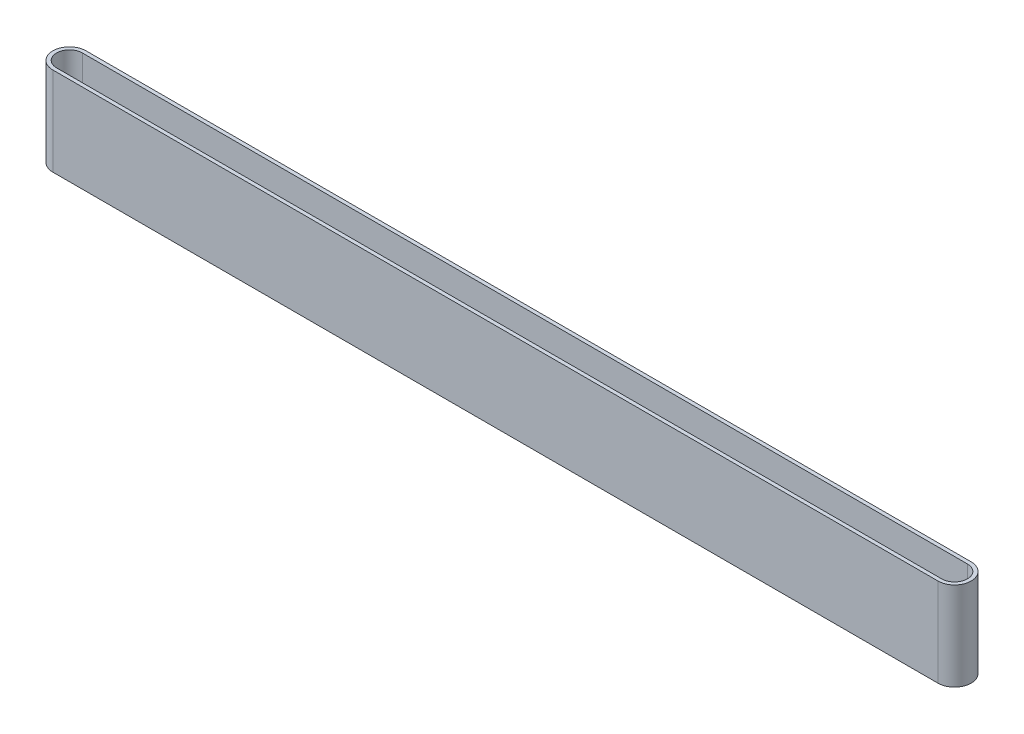
ISO-10303-21;
HEADER;
FILE_DESCRIPTION(('STEP AP214'),'2;1');
FILE_NAME('part.step','',(''),(''),'','','');
FILE_SCHEMA(('AUTOMOTIVE_DESIGN { 1 0 10303 214 1 1 1 1 }'));
ENDSEC;
DATA;
#1=APPLICATION_CONTEXT('core data for automotive mechanical design processes');
#2=APPLICATION_PROTOCOL_DEFINITION('international standard','automotive_design',2000,#1);
#3=PRODUCT_CONTEXT('',#1,'mechanical');
#4=PRODUCT('Part','Part','',(#3));
#5=PRODUCT_RELATED_PRODUCT_CATEGORY('part','',(#4));
#6=PRODUCT_DEFINITION_FORMATION('','',#4);
#7=PRODUCT_DEFINITION_CONTEXT('part definition',#1,'design');
#8=PRODUCT_DEFINITION('design','',#6,#7);
#9=PRODUCT_DEFINITION_SHAPE('','',#8);
#10=(LENGTH_UNIT() NAMED_UNIT(*) SI_UNIT(.MILLI.,.METRE.));
#11=(NAMED_UNIT(*) PLANE_ANGLE_UNIT() SI_UNIT($,.RADIAN.));
#12=(NAMED_UNIT(*) SI_UNIT($,.STERADIAN.) SOLID_ANGLE_UNIT());
#13=UNCERTAINTY_MEASURE_WITH_UNIT(LENGTH_MEASURE(1.E-05),#10,'distance_accuracy_value','');
#14=(GEOMETRIC_REPRESENTATION_CONTEXT(3) GLOBAL_UNCERTAINTY_ASSIGNED_CONTEXT((#13)) GLOBAL_UNIT_ASSIGNED_CONTEXT((#10,
#11,#12)) REPRESENTATION_CONTEXT('',''));
#15=CARTESIAN_POINT('',(0.,0.,0.));
#16=DIRECTION('',(0.,0.,1.));
#17=DIRECTION('',(1.,0.,0.));
#18=AXIS2_PLACEMENT_3D('',#15,#16,#17);
#19=CARTESIAN_POINT('',(0.,76.2,0.));
#20=DIRECTION('',(0.,1.,0.));
#21=DIRECTION('',(0.,0.,1.));
#22=AXIS2_PLACEMENT_3D('',#19,#20,#21);
#23=PLANE('',#22);
#24=CARTESIAN_POINT('',(0.,76.2,0.));
#25=DIRECTION('',(0.,1.,0.));
#26=DIRECTION('',(0.,0.,1.));
#27=AXIS2_PLACEMENT_3D('',#24,#25,#26);
#28=CIRCLE('',#27,14.2875);
#29=CARTESIAN_POINT('',(0.,76.2,-14.2875));
#30=VERTEX_POINT('',#29);
#31=CARTESIAN_POINT('',(0.,76.2,14.2875));
#32=VERTEX_POINT('',#31);
#33=EDGE_CURVE('E134',#30,#32,#28,.T.);
#34=ORIENTED_EDGE('',*,*,#33,.T.);
#35=DIRECTION('',(1.,0.,0.));
#36=VECTOR('',#35,1.);
#37=CARTESIAN_POINT('',(0.,76.2,14.2875));
#38=LINE('',#37,#36);
#39=CARTESIAN_POINT('',(762.,76.2,14.2875));
#40=VERTEX_POINT('',#39);
#41=EDGE_CURVE('E137',#32,#40,#38,.T.);
#42=ORIENTED_EDGE('',*,*,#41,.T.);
#43=CARTESIAN_POINT('',(762.,76.2,0.));
#44=DIRECTION('',(0.,1.,0.));
#45=DIRECTION('',(0.,0.,1.));
#46=AXIS2_PLACEMENT_3D('',#43,#44,#45);
#47=CIRCLE('',#46,14.2875);
#48=CARTESIAN_POINT('',(762.,76.2,-14.2875));
#49=VERTEX_POINT('',#48);
#50=EDGE_CURVE('E140',#40,#49,#47,.T.);
#51=ORIENTED_EDGE('',*,*,#50,.T.);
#52=DIRECTION('',(-1.,0.,0.));
#53=VECTOR('',#52,1.);
#54=CARTESIAN_POINT('',(0.,76.2,-14.2875));
#55=LINE('',#54,#53);
#56=EDGE_CURVE('E142',#49,#30,#55,.T.);
#57=ORIENTED_EDGE('',*,*,#56,.T.);
#58=EDGE_LOOP('',(#34,#42,#51,#57));
#59=FACE_BOUND('',#58,.T.);
#60=DIRECTION('',(1.,0.,0.));
#61=VECTOR('',#60,1.);
#62=CARTESIAN_POINT('',(0.,76.2,11.1125));
#63=LINE('',#62,#61);
#64=CARTESIAN_POINT('',(0.,76.2,11.1125));
#65=VERTEX_POINT('',#64);
#66=CARTESIAN_POINT('',(762.,76.2,11.1125));
#67=VERTEX_POINT('',#66);
#68=EDGE_CURVE('E106',#65,#67,#63,.T.);
#69=ORIENTED_EDGE('',*,*,#68,.F.);
#70=CARTESIAN_POINT('',(0.,76.2,0.));
#71=DIRECTION('',(0.,1.,0.));
#72=DIRECTION('',(0.,0.,1.));
#73=AXIS2_PLACEMENT_3D('',#70,#71,#72);
#74=CIRCLE('',#73,11.1125);
#75=CARTESIAN_POINT('',(0.,76.2,-11.1125));
#76=VERTEX_POINT('',#75);
#77=EDGE_CURVE('E98',#76,#65,#74,.T.);
#78=ORIENTED_EDGE('',*,*,#77,.F.);
#79=DIRECTION('',(-1.,0.,0.));
#80=VECTOR('',#79,1.);
#81=CARTESIAN_POINT('',(0.,76.2,-11.1125));
#82=LINE('',#81,#80);
#83=CARTESIAN_POINT('',(762.,76.2,-11.1125));
#84=VERTEX_POINT('',#83);
#85=EDGE_CURVE('E120',#84,#76,#82,.T.);
#86=ORIENTED_EDGE('',*,*,#85,.F.);
#87=CARTESIAN_POINT('',(762.,76.2,0.));
#88=DIRECTION('',(0.,1.,0.));
#89=DIRECTION('',(0.,0.,1.));
#90=AXIS2_PLACEMENT_3D('',#87,#88,#89);
#91=CIRCLE('',#90,11.1125);
#92=EDGE_CURVE('E118',#67,#84,#91,.T.);
#93=ORIENTED_EDGE('',*,*,#92,.F.);
#94=EDGE_LOOP('',(#69,#78,#86,#93));
#95=FACE_BOUND('',#94,.T.);
#96=ADVANCED_FACE('F33',(#59,#95),#23,.T.);
#97=CARTESIAN_POINT('',(0.,0.,0.));
#98=DIRECTION('',(0.,1.,0.));
#99=DIRECTION('',(0.,0.,1.));
#100=AXIS2_PLACEMENT_3D('',#97,#98,#99);
#101=PLANE('',#100);
#102=CARTESIAN_POINT('',(0.,0.,0.));
#103=DIRECTION('',(0.,1.,0.));
#104=DIRECTION('',(0.,0.,1.));
#105=AXIS2_PLACEMENT_3D('',#102,#103,#104);
#106=CIRCLE('',#105,14.2875);
#107=CARTESIAN_POINT('',(0.,0.,-14.2875));
#108=VERTEX_POINT('',#107);
#109=CARTESIAN_POINT('',(0.,0.,14.2875));
#110=VERTEX_POINT('',#109);
#111=EDGE_CURVE('E114',#108,#110,#106,.T.);
#112=ORIENTED_EDGE('',*,*,#111,.F.);
#113=DIRECTION('',(-1.,0.,0.));
#114=VECTOR('',#113,1.);
#115=CARTESIAN_POINT('',(0.,0.,-14.2875));
#116=LINE('',#115,#114);
#117=CARTESIAN_POINT('',(762.,0.,-14.2875));
#118=VERTEX_POINT('',#117);
#119=EDGE_CURVE('E138',#118,#108,#116,.T.);
#120=ORIENTED_EDGE('',*,*,#119,.F.);
#121=CARTESIAN_POINT('',(762.,0.,0.));
#122=DIRECTION('',(0.,1.,0.));
#123=DIRECTION('',(0.,0.,1.));
#124=AXIS2_PLACEMENT_3D('',#121,#122,#123);
#125=CIRCLE('',#124,14.2875);
#126=CARTESIAN_POINT('',(762.,0.,14.2875));
#127=VERTEX_POINT('',#126);
#128=EDGE_CURVE('E149',#127,#118,#125,.T.);
#129=ORIENTED_EDGE('',*,*,#128,.F.);
#130=DIRECTION('',(1.,0.,0.));
#131=VECTOR('',#130,1.);
#132=CARTESIAN_POINT('',(0.,0.,14.2875));
#133=LINE('',#132,#131);
#134=EDGE_CURVE('E147',#110,#127,#133,.T.);
#135=ORIENTED_EDGE('',*,*,#134,.F.);
#136=EDGE_LOOP('',(#112,#120,#129,#135));
#137=FACE_BOUND('',#136,.T.);
#138=CARTESIAN_POINT('',(0.,0.,0.));
#139=DIRECTION('',(0.,1.,0.));
#140=DIRECTION('',(0.,0.,1.));
#141=AXIS2_PLACEMENT_3D('',#138,#139,#140);
#142=CIRCLE('',#141,11.1125);
#143=CARTESIAN_POINT('',(0.,0.,-11.1125));
#144=VERTEX_POINT('',#143);
#145=CARTESIAN_POINT('',(0.,0.,11.1125));
#146=VERTEX_POINT('',#145);
#147=EDGE_CURVE('E56',#144,#146,#142,.T.);
#148=ORIENTED_EDGE('',*,*,#147,.T.);
#149=DIRECTION('',(1.,0.,0.));
#150=VECTOR('',#149,1.);
#151=CARTESIAN_POINT('',(0.,0.,11.1125));
#152=LINE('',#151,#150);
#153=CARTESIAN_POINT('',(762.,0.,11.1125));
#154=VERTEX_POINT('',#153);
#155=EDGE_CURVE('E113',#146,#154,#152,.T.);
#156=ORIENTED_EDGE('',*,*,#155,.T.);
#157=CARTESIAN_POINT('',(762.,0.,0.));
#158=DIRECTION('',(0.,1.,0.));
#159=DIRECTION('',(0.,0.,1.));
#160=AXIS2_PLACEMENT_3D('',#157,#158,#159);
#161=CIRCLE('',#160,11.1125);
#162=CARTESIAN_POINT('',(762.,0.,-11.1125));
#163=VERTEX_POINT('',#162);
#164=EDGE_CURVE('E126',#154,#163,#161,.T.);
#165=ORIENTED_EDGE('',*,*,#164,.T.);
#166=DIRECTION('',(-1.,0.,0.));
#167=VECTOR('',#166,1.);
#168=CARTESIAN_POINT('',(0.,0.,-11.1125));
#169=LINE('',#168,#167);
#170=EDGE_CURVE('E107',#163,#144,#169,.T.);
#171=ORIENTED_EDGE('',*,*,#170,.T.);
#172=EDGE_LOOP('',(#148,#156,#165,#171));
#173=FACE_BOUND('',#172,.T.);
#174=ADVANCED_FACE('F167',(#137,#173),#101,.F.);
#175=CARTESIAN_POINT('',(0.,76.2,0.));
#176=DIRECTION('',(0.,-1.,0.));
#177=DIRECTION('',(0.,0.,-1.));
#178=AXIS2_PLACEMENT_3D('',#175,#176,#177);
#179=CYLINDRICAL_SURFACE('',#178,14.2875);
#180=ORIENTED_EDGE('',*,*,#111,.T.);
#181=DIRECTION('',(0.,-1.,0.));
#182=VECTOR('',#181,1.);
#183=CARTESIAN_POINT('',(0.,76.2,14.2875));
#184=LINE('',#183,#182);
#185=EDGE_CURVE('E11',#32,#110,#184,.T.);
#186=ORIENTED_EDGE('',*,*,#185,.F.);
#187=ORIENTED_EDGE('',*,*,#33,.F.);
#188=DIRECTION('',(0.,-1.,0.));
#189=VECTOR('',#188,1.);
#190=CARTESIAN_POINT('',(0.,76.2,-14.2875));
#191=LINE('',#190,#189);
#192=EDGE_CURVE('E144',#30,#108,#191,.T.);
#193=ORIENTED_EDGE('',*,*,#192,.T.);
#194=EDGE_LOOP('',(#180,#186,#187,#193));
#195=FACE_BOUND('',#194,.T.);
#196=ADVANCED_FACE('F35',(#195),#179,.T.);
#197=CARTESIAN_POINT('',(0.,76.2,14.2875));
#198=DIRECTION('',(0.,0.,-1.));
#199=DIRECTION('',(-1.,0.,0.));
#200=AXIS2_PLACEMENT_3D('',#197,#198,#199);
#201=PLANE('',#200);
#202=ORIENTED_EDGE('',*,*,#134,.T.);
#203=DIRECTION('',(0.,-1.,0.));
#204=VECTOR('',#203,1.);
#205=CARTESIAN_POINT('',(762.,76.2,14.2875));
#206=LINE('',#205,#204);
#207=EDGE_CURVE('E41',#40,#127,#206,.T.);
#208=ORIENTED_EDGE('',*,*,#207,.F.);
#209=ORIENTED_EDGE('',*,*,#41,.F.);
#210=ORIENTED_EDGE('',*,*,#185,.T.);
#211=EDGE_LOOP('',(#202,#208,#209,#210));
#212=FACE_BOUND('',#211,.T.);
#213=ADVANCED_FACE('F177',(#212),#201,.F.);
#214=CARTESIAN_POINT('',(762.,76.2,0.));
#215=DIRECTION('',(0.,-1.,0.));
#216=DIRECTION('',(0.,0.,-1.));
#217=AXIS2_PLACEMENT_3D('',#214,#215,#216);
#218=CYLINDRICAL_SURFACE('',#217,14.2875);
#219=ORIENTED_EDGE('',*,*,#128,.T.);
#220=DIRECTION('',(0.,-1.,0.));
#221=VECTOR('',#220,1.);
#222=CARTESIAN_POINT('',(762.,76.2,-14.2875));
#223=LINE('',#222,#221);
#224=EDGE_CURVE('E154',#49,#118,#223,.T.);
#225=ORIENTED_EDGE('',*,*,#224,.F.);
#226=ORIENTED_EDGE('',*,*,#50,.F.);
#227=ORIENTED_EDGE('',*,*,#207,.T.);
#228=EDGE_LOOP('',(#219,#225,#226,#227));
#229=FACE_BOUND('',#228,.T.);
#230=ADVANCED_FACE('F161',(#229),#218,.T.);
#231=CARTESIAN_POINT('',(0.,76.2,-14.2875));
#232=DIRECTION('',(0.,0.,1.));
#233=DIRECTION('',(1.,0.,0.));
#234=AXIS2_PLACEMENT_3D('',#231,#232,#233);
#235=PLANE('',#234);
#236=ORIENTED_EDGE('',*,*,#119,.T.);
#237=ORIENTED_EDGE('',*,*,#192,.F.);
#238=ORIENTED_EDGE('',*,*,#56,.F.);
#239=ORIENTED_EDGE('',*,*,#224,.T.);
#240=EDGE_LOOP('',(#236,#237,#238,#239));
#241=FACE_BOUND('',#240,.T.);
#242=ADVANCED_FACE('F171',(#241),#235,.F.);
#243=CARTESIAN_POINT('',(0.,76.2,0.));
#244=DIRECTION('',(0.,-1.,0.));
#245=DIRECTION('',(0.,0.,-1.));
#246=AXIS2_PLACEMENT_3D('',#243,#244,#245);
#247=CYLINDRICAL_SURFACE('',#246,11.1125);
#248=ORIENTED_EDGE('',*,*,#147,.F.);
#249=DIRECTION('',(0.,-1.,0.));
#250=VECTOR('',#249,1.);
#251=CARTESIAN_POINT('',(0.,76.2,-11.1125));
#252=LINE('',#251,#250);
#253=EDGE_CURVE('E102',#76,#144,#252,.T.);
#254=ORIENTED_EDGE('',*,*,#253,.F.);
#255=ORIENTED_EDGE('',*,*,#77,.T.);
#256=DIRECTION('',(0.,-1.,0.));
#257=VECTOR('',#256,1.);
#258=CARTESIAN_POINT('',(0.,76.2,11.1125));
#259=LINE('',#258,#257);
#260=EDGE_CURVE('E101',#65,#146,#259,.T.);
#261=ORIENTED_EDGE('',*,*,#260,.T.);
#262=EDGE_LOOP('',(#248,#254,#255,#261));
#263=FACE_BOUND('',#262,.T.);
#264=ADVANCED_FACE('F100',(#263),#247,.F.);
#265=CARTESIAN_POINT('',(0.,76.2,11.1125));
#266=DIRECTION('',(0.,0.,-1.));
#267=DIRECTION('',(-1.,0.,0.));
#268=AXIS2_PLACEMENT_3D('',#265,#266,#267);
#269=PLANE('',#268);
#270=ORIENTED_EDGE('',*,*,#155,.F.);
#271=ORIENTED_EDGE('',*,*,#260,.F.);
#272=ORIENTED_EDGE('',*,*,#68,.T.);
#273=DIRECTION('',(0.,-1.,0.));
#274=VECTOR('',#273,1.);
#275=CARTESIAN_POINT('',(762.,76.2,11.1125));
#276=LINE('',#275,#274);
#277=EDGE_CURVE('E115',#67,#154,#276,.T.);
#278=ORIENTED_EDGE('',*,*,#277,.T.);
#279=EDGE_LOOP('',(#270,#271,#272,#278));
#280=FACE_BOUND('',#279,.T.);
#281=ADVANCED_FACE('F110',(#280),#269,.T.);
#282=CARTESIAN_POINT('',(762.,76.2,0.));
#283=DIRECTION('',(0.,-1.,0.));
#284=DIRECTION('',(0.,0.,-1.));
#285=AXIS2_PLACEMENT_3D('',#282,#283,#284);
#286=CYLINDRICAL_SURFACE('',#285,11.1125);
#287=ORIENTED_EDGE('',*,*,#164,.F.);
#288=ORIENTED_EDGE('',*,*,#277,.F.);
#289=ORIENTED_EDGE('',*,*,#92,.T.);
#290=DIRECTION('',(0.,-1.,0.));
#291=VECTOR('',#290,1.);
#292=CARTESIAN_POINT('',(762.,76.2,-11.1125));
#293=LINE('',#292,#291);
#294=EDGE_CURVE('E48',#84,#163,#293,.T.);
#295=ORIENTED_EDGE('',*,*,#294,.T.);
#296=EDGE_LOOP('',(#287,#288,#289,#295));
#297=FACE_BOUND('',#296,.T.);
#298=ADVANCED_FACE('F200',(#297),#286,.F.);
#299=CARTESIAN_POINT('',(0.,76.2,-11.1125));
#300=DIRECTION('',(0.,0.,1.));
#301=DIRECTION('',(1.,0.,0.));
#302=AXIS2_PLACEMENT_3D('',#299,#300,#301);
#303=PLANE('',#302);
#304=ORIENTED_EDGE('',*,*,#170,.F.);
#305=ORIENTED_EDGE('',*,*,#294,.F.);
#306=ORIENTED_EDGE('',*,*,#85,.T.);
#307=ORIENTED_EDGE('',*,*,#253,.T.);
#308=EDGE_LOOP('',(#304,#305,#306,#307));
#309=FACE_BOUND('',#308,.T.);
#310=ADVANCED_FACE('F204',(#309),#303,.T.);
#311=CLOSED_SHELL('',(#96,#174,#196,#213,#230,#242,#264,#281,#298,#310));
#312=MANIFOLD_SOLID_BREP('B2',#311);
#313=ADVANCED_BREP_SHAPE_REPRESENTATION('',(#18,#312),#14);
#314=SHAPE_DEFINITION_REPRESENTATION(#9,#313);
ENDSEC;
END-ISO-10303-21;
